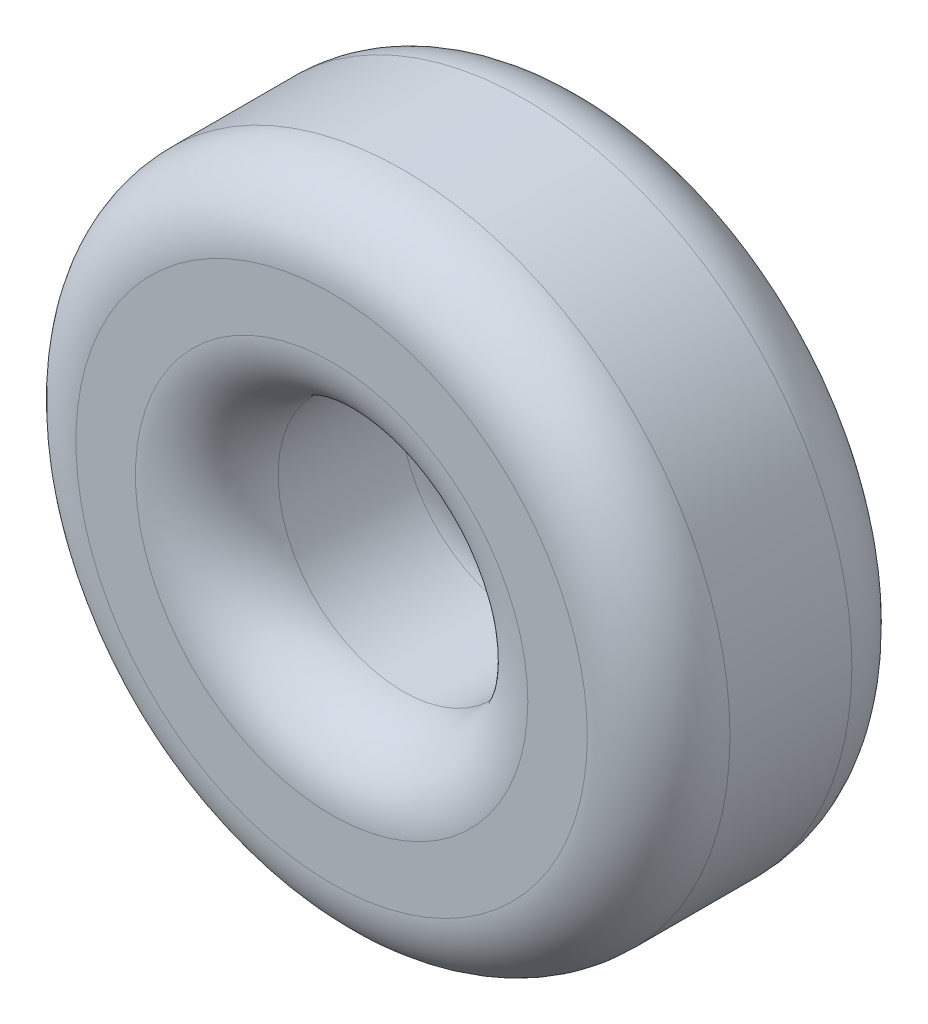
ISO-10303-21;
HEADER;
FILE_DESCRIPTION(('STEP AP214'),'2;1');
FILE_NAME('part.step','',(''),(''),'','','');
FILE_SCHEMA(('AUTOMOTIVE_DESIGN { 1 0 10303 214 1 1 1 1 }'));
ENDSEC;
DATA;
#1=APPLICATION_CONTEXT('core data for automotive mechanical design processes');
#2=APPLICATION_PROTOCOL_DEFINITION('international standard','automotive_design',2000,#1);
#3=PRODUCT_CONTEXT('',#1,'mechanical');
#4=PRODUCT('Part','Part','',(#3));
#5=PRODUCT_RELATED_PRODUCT_CATEGORY('part','',(#4));
#6=PRODUCT_DEFINITION_FORMATION('','',#4);
#7=PRODUCT_DEFINITION_CONTEXT('part definition',#1,'design');
#8=PRODUCT_DEFINITION('design','',#6,#7);
#9=PRODUCT_DEFINITION_SHAPE('','',#8);
#10=(LENGTH_UNIT() NAMED_UNIT(*) SI_UNIT(.MILLI.,.METRE.));
#11=(NAMED_UNIT(*) PLANE_ANGLE_UNIT() SI_UNIT($,.RADIAN.));
#12=(NAMED_UNIT(*) SI_UNIT($,.STERADIAN.) SOLID_ANGLE_UNIT());
#13=UNCERTAINTY_MEASURE_WITH_UNIT(LENGTH_MEASURE(1.E-05),#10,'distance_accuracy_value','');
#14=(GEOMETRIC_REPRESENTATION_CONTEXT(3) GLOBAL_UNCERTAINTY_ASSIGNED_CONTEXT((#13)) GLOBAL_UNIT_ASSIGNED_CONTEXT((#10,
#11,#12)) REPRESENTATION_CONTEXT('',''));
#15=CARTESIAN_POINT('',(0.,0.,0.));
#16=DIRECTION('',(0.,0.,1.));
#17=DIRECTION('',(1.,0.,0.));
#18=AXIS2_PLACEMENT_3D('',#15,#16,#17);
#19=CARTESIAN_POINT('',(-9.7809252389853,3.80388058610914,44.5));
#20=DIRECTION('',(0.,0.,1.));
#21=DIRECTION('',(1.,0.,0.));
#22=AXIS2_PLACEMENT_3D('',#19,#20,#21);
#23=PLANE('',#22);
#24=CARTESIAN_POINT('',(-9.7809252389853,3.80388058610914,44.5));
#25=DIRECTION('',(0.,0.,1.));
#26=DIRECTION('',(1.,0.,0.));
#27=AXIS2_PLACEMENT_3D('',#24,#25,#26);
#28=CIRCLE('',#27,33.);
#29=CARTESIAN_POINT('',(23.2190747610147,3.80388058610914,44.5));
#30=VERTEX_POINT('',#29);
#31=EDGE_CURVE('E10',#30,#30,#28,.F.);
#32=ORIENTED_EDGE('',*,*,#31,.T.);
#33=EDGE_LOOP('',(#32));
#34=FACE_BOUND('',#33,.T.);
#35=CARTESIAN_POINT('',(-9.7809252389853,3.80388058610914,44.5));
#36=DIRECTION('',(0.,0.,1.));
#37=DIRECTION('',(1.,0.,0.));
#38=AXIS2_PLACEMENT_3D('',#35,#36,#37);
#39=CIRCLE('',#38,43.);
#40=CARTESIAN_POINT('',(33.2190747610147,3.80388058610914,44.5));
#41=VERTEX_POINT('',#40);
#42=EDGE_CURVE('E37',#41,#41,#39,.T.);
#43=ORIENTED_EDGE('',*,*,#42,.T.);
#44=EDGE_LOOP('',(#43));
#45=FACE_BOUND('',#44,.T.);
#46=ADVANCED_FACE('F30',(#34,#45),#23,.T.);
#47=CARTESIAN_POINT('',(-9.7809252389853,3.80388058610914,0.));
#48=DIRECTION('',(0.,0.,1.));
#49=DIRECTION('',(1.,0.,0.));
#50=AXIS2_PLACEMENT_3D('',#47,#48,#49);
#51=PLANE('',#50);
#52=CARTESIAN_POINT('',(-9.7809252389853,3.80388058610914,0.));
#53=DIRECTION('',(0.,0.,1.));
#54=DIRECTION('',(1.,0.,0.));
#55=AXIS2_PLACEMENT_3D('',#52,#53,#54);
#56=CIRCLE('',#55,33.);
#57=CARTESIAN_POINT('',(23.2190747610147,3.80388058610914,0.));
#58=VERTEX_POINT('',#57);
#59=EDGE_CURVE('E56',#58,#58,#56,.T.);
#60=ORIENTED_EDGE('',*,*,#59,.T.);
#61=EDGE_LOOP('',(#60));
#62=FACE_BOUND('',#61,.T.);
#63=CARTESIAN_POINT('',(-9.7809252389853,3.80388058610914,0.));
#64=DIRECTION('',(0.,0.,1.));
#65=DIRECTION('',(1.,0.,0.));
#66=AXIS2_PLACEMENT_3D('',#63,#64,#65);
#67=CIRCLE('',#66,43.);
#68=CARTESIAN_POINT('',(33.2190747610147,3.80388058610914,0.));
#69=VERTEX_POINT('',#68);
#70=EDGE_CURVE('E59',#69,#69,#67,.F.);
#71=ORIENTED_EDGE('',*,*,#70,.T.);
#72=EDGE_LOOP('',(#71));
#73=FACE_BOUND('',#72,.T.);
#74=ADVANCED_FACE('F63',(#62,#73),#51,.F.);
#75=CARTESIAN_POINT('',(-9.7809252389853,3.80388058610914,44.5));
#76=DIRECTION('',(0.,0.,-1.));
#77=DIRECTION('',(-1.,0.,0.));
#78=AXIS2_PLACEMENT_3D('',#75,#76,#77);
#79=CYLINDRICAL_SURFACE('',#78,55.);
#80=CARTESIAN_POINT('',(-9.7809252389853,3.80388058610914,12.));
#81=DIRECTION('',(0.,0.,1.));
#82=DIRECTION('',(1.,0.,0.));
#83=AXIS2_PLACEMENT_3D('',#80,#81,#82);
#84=CIRCLE('',#83,55.);
#85=CARTESIAN_POINT('',(45.2190747610147,3.80388058610914,12.));
#86=VERTEX_POINT('',#85);
#87=EDGE_CURVE('E41',#86,#86,#84,.T.);
#88=ORIENTED_EDGE('',*,*,#87,.T.);
#89=EDGE_LOOP('',(#88));
#90=FACE_BOUND('',#89,.T.);
#91=CARTESIAN_POINT('',(-9.7809252389853,3.80388058610914,32.5));
#92=DIRECTION('',(0.,0.,1.));
#93=DIRECTION('',(1.,0.,0.));
#94=AXIS2_PLACEMENT_3D('',#91,#92,#93);
#95=CIRCLE('',#94,55.);
#96=CARTESIAN_POINT('',(45.2190747610147,3.80388058610914,32.5));
#97=VERTEX_POINT('',#96);
#98=EDGE_CURVE('E45',#97,#97,#95,.F.);
#99=ORIENTED_EDGE('',*,*,#98,.T.);
#100=EDGE_LOOP('',(#99));
#101=FACE_BOUND('',#100,.T.);
#102=ADVANCED_FACE('F73',(#90,#101),#79,.T.);
#103=CARTESIAN_POINT('',(-9.7809252389853,3.80388058610914,44.5));
#104=DIRECTION('',(0.,0.,-1.));
#105=DIRECTION('',(-1.,0.,0.));
#106=AXIS2_PLACEMENT_3D('',#103,#104,#105);
#107=CYLINDRICAL_SURFACE('',#106,21.);
#108=CARTESIAN_POINT('',(-9.7809252389853,3.80388058610914,12.));
#109=DIRECTION('',(0.,0.,1.));
#110=DIRECTION('',(1.,0.,0.));
#111=AXIS2_PLACEMENT_3D('',#108,#109,#110);
#112=CIRCLE('',#111,21.);
#113=CARTESIAN_POINT('',(11.2190747610147,3.80388058610914,12.));
#114=VERTEX_POINT('',#113);
#115=EDGE_CURVE('E50',#114,#114,#112,.F.);
#116=ORIENTED_EDGE('',*,*,#115,.T.);
#117=EDGE_LOOP('',(#116));
#118=FACE_BOUND('',#117,.T.);
#119=CARTESIAN_POINT('',(-9.7809252389853,3.80388058610914,32.5));
#120=DIRECTION('',(0.,0.,1.));
#121=DIRECTION('',(1.,0.,0.));
#122=AXIS2_PLACEMENT_3D('',#119,#120,#121);
#123=CIRCLE('',#122,21.);
#124=CARTESIAN_POINT('',(11.2190747610147,3.80388058610914,32.5));
#125=VERTEX_POINT('',#124);
#126=EDGE_CURVE('E53',#125,#125,#123,.T.);
#127=ORIENTED_EDGE('',*,*,#126,.T.);
#128=EDGE_LOOP('',(#127));
#129=FACE_BOUND('',#128,.T.);
#130=ADVANCED_FACE('F76',(#118,#129),#107,.F.);
#131=CARTESIAN_POINT('',(-9.7809252389853,3.80388058610914,12.));
#132=DIRECTION('',(0.,0.,1.));
#133=DIRECTION('',(1.,0.,0.));
#134=AXIS2_PLACEMENT_3D('',#131,#132,#133);
#135=TOROIDAL_SURFACE('',#134,33.,12.);
#136=ORIENTED_EDGE('',*,*,#115,.F.);
#137=EDGE_LOOP('',(#136));
#138=FACE_BOUND('',#137,.T.);
#139=ORIENTED_EDGE('',*,*,#59,.F.);
#140=EDGE_LOOP('',(#139));
#141=FACE_BOUND('',#140,.T.);
#142=ADVANCED_FACE('F69',(#138,#141),#135,.T.);
#143=CARTESIAN_POINT('',(-9.7809252389853,3.80388058610914,12.));
#144=DIRECTION('',(0.,0.,1.));
#145=DIRECTION('',(1.,0.,0.));
#146=AXIS2_PLACEMENT_3D('',#143,#144,#145);
#147=TOROIDAL_SURFACE('',#146,43.,12.);
#148=ORIENTED_EDGE('',*,*,#70,.F.);
#149=EDGE_LOOP('',(#148));
#150=FACE_BOUND('',#149,.T.);
#151=ORIENTED_EDGE('',*,*,#87,.F.);
#152=EDGE_LOOP('',(#151));
#153=FACE_BOUND('',#152,.T.);
#154=ADVANCED_FACE('F65',(#150,#153),#147,.T.);
#155=CARTESIAN_POINT('',(-9.7809252389853,3.80388058610914,32.5));
#156=DIRECTION('',(0.,0.,1.));
#157=DIRECTION('',(1.,0.,0.));
#158=AXIS2_PLACEMENT_3D('',#155,#156,#157);
#159=TOROIDAL_SURFACE('',#158,33.,12.);
#160=ORIENTED_EDGE('',*,*,#31,.F.);
#161=EDGE_LOOP('',(#160));
#162=FACE_BOUND('',#161,.T.);
#163=ORIENTED_EDGE('',*,*,#126,.F.);
#164=EDGE_LOOP('',(#163));
#165=FACE_BOUND('',#164,.T.);
#166=ADVANCED_FACE('F68',(#162,#165),#159,.T.);
#167=CARTESIAN_POINT('',(-9.7809252389853,3.80388058610914,32.5));
#168=DIRECTION('',(0.,0.,1.));
#169=DIRECTION('',(1.,0.,0.));
#170=AXIS2_PLACEMENT_3D('',#167,#168,#169);
#171=TOROIDAL_SURFACE('',#170,43.,12.);
#172=ORIENTED_EDGE('',*,*,#98,.F.);
#173=EDGE_LOOP('',(#172));
#174=FACE_BOUND('',#173,.T.);
#175=ORIENTED_EDGE('',*,*,#42,.F.);
#176=EDGE_LOOP('',(#175));
#177=FACE_BOUND('',#176,.T.);
#178=ADVANCED_FACE('F32',(#174,#177),#171,.T.);
#179=CLOSED_SHELL('',(#46,#74,#102,#130,#142,#154,#166,#178));
#180=MANIFOLD_SOLID_BREP('B2',#179);
#181=ADVANCED_BREP_SHAPE_REPRESENTATION('',(#18,#180),#14);
#182=SHAPE_DEFINITION_REPRESENTATION(#9,#181);
ENDSEC;
END-ISO-10303-21;
